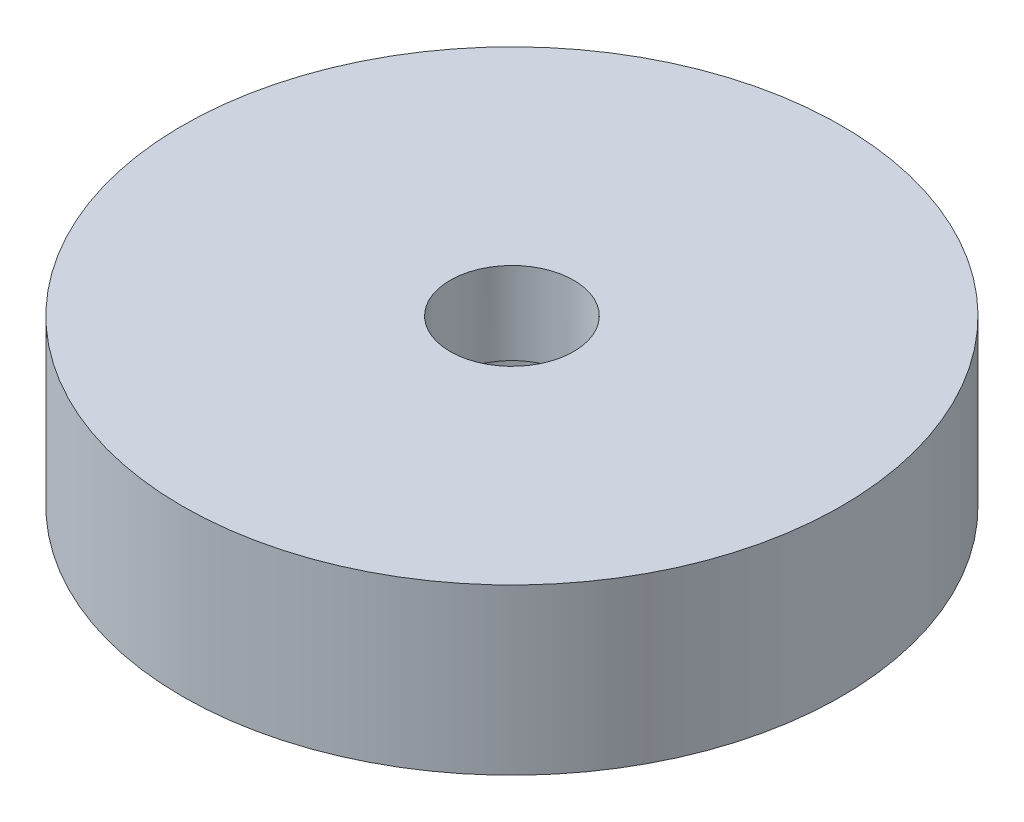
ISO-10303-21;
HEADER;
FILE_DESCRIPTION(('STEP AP214'),'2;1');
FILE_NAME('part.step','',(''),(''),'','','');
FILE_SCHEMA(('AUTOMOTIVE_DESIGN { 1 0 10303 214 1 1 1 1 }'));
ENDSEC;
DATA;
#1=APPLICATION_CONTEXT('core data for automotive mechanical design processes');
#2=APPLICATION_PROTOCOL_DEFINITION('international standard','automotive_design',2000,#1);
#3=PRODUCT_CONTEXT('',#1,'mechanical');
#4=PRODUCT('Part','Part','',(#3));
#5=PRODUCT_RELATED_PRODUCT_CATEGORY('part','',(#4));
#6=PRODUCT_DEFINITION_FORMATION('','',#4);
#7=PRODUCT_DEFINITION_CONTEXT('part definition',#1,'design');
#8=PRODUCT_DEFINITION('design','',#6,#7);
#9=PRODUCT_DEFINITION_SHAPE('','',#8);
#10=(LENGTH_UNIT() NAMED_UNIT(*) SI_UNIT(.MILLI.,.METRE.));
#11=(NAMED_UNIT(*) PLANE_ANGLE_UNIT() SI_UNIT($,.RADIAN.));
#12=(NAMED_UNIT(*) SI_UNIT($,.STERADIAN.) SOLID_ANGLE_UNIT());
#13=UNCERTAINTY_MEASURE_WITH_UNIT(LENGTH_MEASURE(1.E-05),#10,'distance_accuracy_value','');
#14=(GEOMETRIC_REPRESENTATION_CONTEXT(3) GLOBAL_UNCERTAINTY_ASSIGNED_CONTEXT((#13)) GLOBAL_UNIT_ASSIGNED_CONTEXT((#10,
#11,#12)) REPRESENTATION_CONTEXT('',''));
#15=CARTESIAN_POINT('',(0.,0.,0.));
#16=DIRECTION('',(0.,0.,1.));
#17=DIRECTION('',(1.,0.,0.));
#18=AXIS2_PLACEMENT_3D('',#15,#16,#17);
#19=CARTESIAN_POINT('',(0.,0.,0.));
#20=DIRECTION('',(0.,1.,0.));
#21=DIRECTION('',(0.,0.,1.));
#22=AXIS2_PLACEMENT_3D('',#19,#20,#21);
#23=CYLINDRICAL_SURFACE('',#22,4.7625);
#24=CARTESIAN_POINT('',(0.,12.7,0.));
#25=DIRECTION('',(0.,1.,0.));
#26=DIRECTION('',(0.,0.,1.));
#27=AXIS2_PLACEMENT_3D('',#24,#25,#26);
#28=CIRCLE('',#27,4.7625);
#29=CARTESIAN_POINT('',(0.,12.7,4.7625));
#30=VERTEX_POINT('',#29);
#31=EDGE_CURVE('E43',#30,#30,#28,.T.);
#32=ORIENTED_EDGE('',*,*,#31,.T.);
#33=EDGE_LOOP('',(#32));
#34=FACE_BOUND('',#33,.T.);
#35=CARTESIAN_POINT('',(0.,6.35,0.));
#36=DIRECTION('',(0.,-1.,0.));
#37=DIRECTION('',(0.,0.,-1.));
#38=AXIS2_PLACEMENT_3D('',#35,#36,#37);
#39=CIRCLE('',#38,4.7625);
#40=CARTESIAN_POINT('',(0.,6.35,-4.7625));
#41=VERTEX_POINT('',#40);
#42=EDGE_CURVE('E34',#41,#41,#39,.F.);
#43=ORIENTED_EDGE('',*,*,#42,.F.);
#44=EDGE_LOOP('',(#43));
#45=FACE_BOUND('',#44,.T.);
#46=ADVANCED_FACE('F30',(#34,#45),#23,.F.);
#47=CARTESIAN_POINT('',(0.,12.7,0.));
#48=DIRECTION('',(0.,-1.,0.));
#49=DIRECTION('',(0.,0.,-1.));
#50=AXIS2_PLACEMENT_3D('',#47,#48,#49);
#51=CYLINDRICAL_SURFACE('',#50,25.4);
#52=CARTESIAN_POINT('',(0.,12.7,0.));
#53=DIRECTION('',(0.,1.,0.));
#54=DIRECTION('',(0.,0.,1.));
#55=AXIS2_PLACEMENT_3D('',#52,#53,#54);
#56=CIRCLE('',#55,25.4);
#57=CARTESIAN_POINT('',(0.,12.7,25.4));
#58=VERTEX_POINT('',#57);
#59=EDGE_CURVE('E10',#58,#58,#56,.T.);
#60=ORIENTED_EDGE('',*,*,#59,.F.);
#61=EDGE_LOOP('',(#60));
#62=FACE_BOUND('',#61,.T.);
#63=CARTESIAN_POINT('',(0.,0.,0.));
#64=DIRECTION('',(0.,1.,0.));
#65=DIRECTION('',(0.,0.,1.));
#66=AXIS2_PLACEMENT_3D('',#63,#64,#65);
#67=CIRCLE('',#66,25.4);
#68=CARTESIAN_POINT('',(0.,0.,25.4));
#69=VERTEX_POINT('',#68);
#70=EDGE_CURVE('E38',#69,#69,#67,.T.);
#71=ORIENTED_EDGE('',*,*,#70,.T.);
#72=EDGE_LOOP('',(#71));
#73=FACE_BOUND('',#72,.T.);
#74=ADVANCED_FACE('F32',(#62,#73),#51,.T.);
#75=CARTESIAN_POINT('',(0.,12.7,0.));
#76=DIRECTION('',(0.,1.,0.));
#77=DIRECTION('',(0.,0.,1.));
#78=AXIS2_PLACEMENT_3D('',#75,#76,#77);
#79=PLANE('',#78);
#80=ORIENTED_EDGE('',*,*,#31,.F.);
#81=EDGE_LOOP('',(#80));
#82=FACE_BOUND('',#81,.T.);
#83=ORIENTED_EDGE('',*,*,#59,.T.);
#84=EDGE_LOOP('',(#83));
#85=FACE_BOUND('',#84,.T.);
#86=ADVANCED_FACE('F65',(#82,#85),#79,.T.);
#87=CARTESIAN_POINT('',(0.,0.,0.));
#88=DIRECTION('',(0.,1.,0.));
#89=DIRECTION('',(0.,0.,1.));
#90=AXIS2_PLACEMENT_3D('',#87,#88,#89);
#91=PLANE('',#90);
#92=CARTESIAN_POINT('',(0.,0.,0.));
#93=DIRECTION('',(0.,-1.,0.));
#94=DIRECTION('',(0.,0.,-1.));
#95=AXIS2_PLACEMENT_3D('',#92,#93,#94);
#96=CIRCLE('',#95,9.525);
#97=CARTESIAN_POINT('',(0.,0.,-9.525));
#98=VERTEX_POINT('',#97);
#99=EDGE_CURVE('E47',#98,#98,#96,.T.);
#100=ORIENTED_EDGE('',*,*,#99,.F.);
#101=EDGE_LOOP('',(#100));
#102=FACE_BOUND('',#101,.T.);
#103=ORIENTED_EDGE('',*,*,#70,.F.);
#104=EDGE_LOOP('',(#103));
#105=FACE_BOUND('',#104,.T.);
#106=ADVANCED_FACE('F72',(#102,#105),#91,.F.);
#107=CARTESIAN_POINT('',(0.,6.35,0.));
#108=DIRECTION('',(0.,-1.,0.));
#109=DIRECTION('',(0.,0.,-1.));
#110=AXIS2_PLACEMENT_3D('',#107,#108,#109);
#111=PLANE('',#110);
#112=CARTESIAN_POINT('',(0.,6.35,0.));
#113=DIRECTION('',(0.,-1.,0.));
#114=DIRECTION('',(0.,0.,-1.));
#115=AXIS2_PLACEMENT_3D('',#112,#113,#114);
#116=CIRCLE('',#115,9.525);
#117=CARTESIAN_POINT('',(0.,6.35,-9.525));
#118=VERTEX_POINT('',#117);
#119=EDGE_CURVE('E50',#118,#118,#116,.T.);
#120=ORIENTED_EDGE('',*,*,#119,.T.);
#121=EDGE_LOOP('',(#120));
#122=FACE_BOUND('',#121,.T.);
#123=ORIENTED_EDGE('',*,*,#42,.T.);
#124=EDGE_LOOP('',(#123));
#125=FACE_BOUND('',#124,.T.);
#126=ADVANCED_FACE('F57',(#122,#125),#111,.T.);
#127=CARTESIAN_POINT('',(0.,6.35,0.));
#128=DIRECTION('',(0.,-1.,0.));
#129=DIRECTION('',(0.,0.,-1.));
#130=AXIS2_PLACEMENT_3D('',#127,#128,#129);
#131=CYLINDRICAL_SURFACE('',#130,9.525);
#132=ORIENTED_EDGE('',*,*,#119,.F.);
#133=EDGE_LOOP('',(#132));
#134=FACE_BOUND('',#133,.T.);
#135=ORIENTED_EDGE('',*,*,#99,.T.);
#136=EDGE_LOOP('',(#135));
#137=FACE_BOUND('',#136,.T.);
#138=ADVANCED_FACE('F69',(#134,#137),#131,.F.);
#139=CLOSED_SHELL('',(#46,#74,#86,#106,#126,#138));
#140=MANIFOLD_SOLID_BREP('B2',#139);
#141=ADVANCED_BREP_SHAPE_REPRESENTATION('',(#18,#140),#14);
#142=SHAPE_DEFINITION_REPRESENTATION(#9,#141);
ENDSEC;
END-ISO-10303-21;
